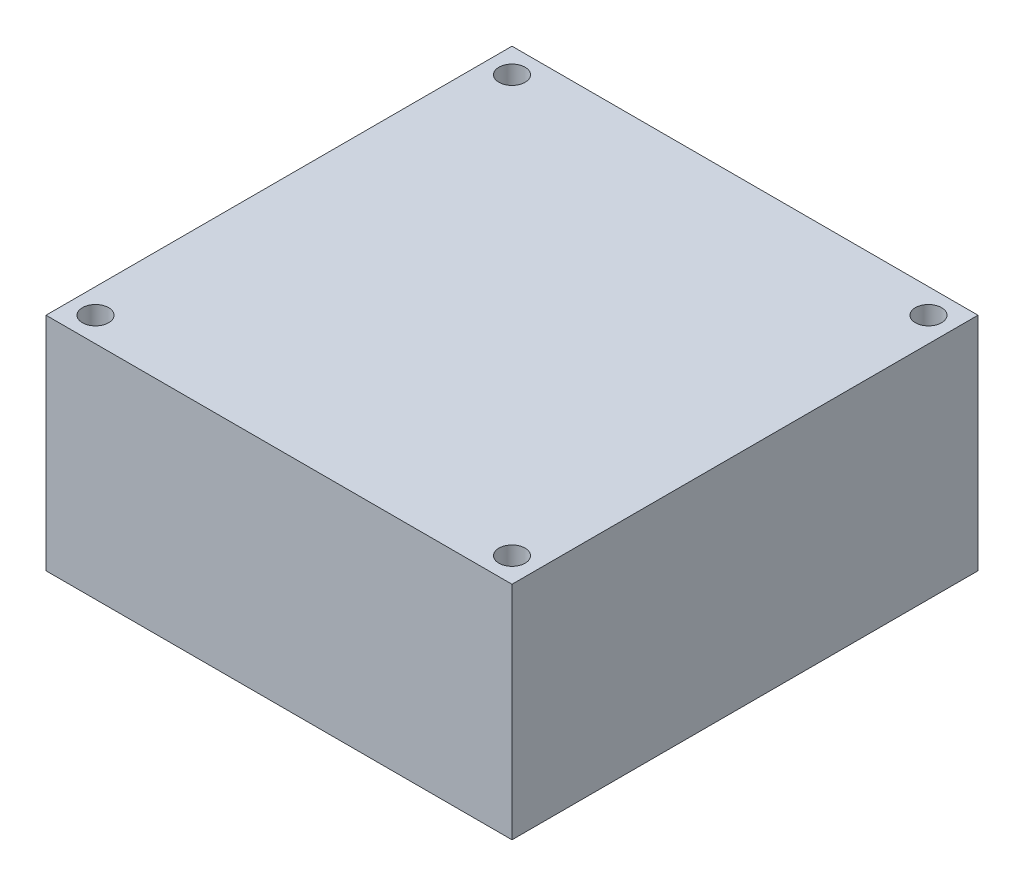
ISO-10303-21;
HEADER;
FILE_DESCRIPTION(('STEP AP214'),'2;1');
FILE_NAME('part.step','',(''),(''),'','','');
FILE_SCHEMA(('AUTOMOTIVE_DESIGN { 1 0 10303 214 1 1 1 1 }'));
ENDSEC;
DATA;
#1=APPLICATION_CONTEXT('core data for automotive mechanical design processes');
#2=APPLICATION_PROTOCOL_DEFINITION('international standard','automotive_design',2000,#1);
#3=PRODUCT_CONTEXT('',#1,'mechanical');
#4=PRODUCT('Part','Part','',(#3));
#5=PRODUCT_RELATED_PRODUCT_CATEGORY('part','',(#4));
#6=PRODUCT_DEFINITION_FORMATION('','',#4);
#7=PRODUCT_DEFINITION_CONTEXT('part definition',#1,'design');
#8=PRODUCT_DEFINITION('design','',#6,#7);
#9=PRODUCT_DEFINITION_SHAPE('','',#8);
#10=(LENGTH_UNIT() NAMED_UNIT(*) SI_UNIT(.MILLI.,.METRE.));
#11=(NAMED_UNIT(*) PLANE_ANGLE_UNIT() SI_UNIT($,.RADIAN.));
#12=(NAMED_UNIT(*) SI_UNIT($,.STERADIAN.) SOLID_ANGLE_UNIT());
#13=UNCERTAINTY_MEASURE_WITH_UNIT(LENGTH_MEASURE(1.E-05),#10,'distance_accuracy_value','');
#14=(GEOMETRIC_REPRESENTATION_CONTEXT(3) GLOBAL_UNCERTAINTY_ASSIGNED_CONTEXT((#13)) GLOBAL_UNIT_ASSIGNED_CONTEXT((#10,
#11,#12)) REPRESENTATION_CONTEXT('',''));
#15=CARTESIAN_POINT('',(0.,0.,0.));
#16=DIRECTION('',(0.,0.,1.));
#17=DIRECTION('',(1.,0.,0.));
#18=AXIS2_PLACEMENT_3D('',#15,#16,#17);
#19=CARTESIAN_POINT('',(0.,38.,0.));
#20=DIRECTION('',(1.,0.,0.));
#21=DIRECTION('',(0.,0.,-1.));
#22=AXIS2_PLACEMENT_3D('',#19,#20,#21);
#23=PLANE('',#22);
#24=DIRECTION('',(0.,0.,1.));
#25=VECTOR('',#24,1.);
#26=CARTESIAN_POINT('',(0.,0.,0.));
#27=LINE('',#26,#25);
#28=CARTESIAN_POINT('',(0.,0.,-80.));
#29=VERTEX_POINT('',#28);
#30=CARTESIAN_POINT('',(0.,0.,0.));
#31=VERTEX_POINT('',#30);
#32=EDGE_CURVE('E96',#29,#31,#27,.T.);
#33=ORIENTED_EDGE('',*,*,#32,.T.);
#34=DIRECTION('',(0.,-1.,0.));
#35=VECTOR('',#34,1.);
#36=CARTESIAN_POINT('',(0.,38.,0.));
#37=LINE('',#36,#35);
#38=CARTESIAN_POINT('',(0.,38.,0.));
#39=VERTEX_POINT('',#38);
#40=EDGE_CURVE('E11',#39,#31,#37,.T.);
#41=ORIENTED_EDGE('',*,*,#40,.F.);
#42=DIRECTION('',(0.,0.,1.));
#43=VECTOR('',#42,1.);
#44=CARTESIAN_POINT('',(0.,38.,0.));
#45=LINE('',#44,#43);
#46=CARTESIAN_POINT('',(0.,38.,-80.));
#47=VERTEX_POINT('',#46);
#48=EDGE_CURVE('E84',#47,#39,#45,.T.);
#49=ORIENTED_EDGE('',*,*,#48,.F.);
#50=DIRECTION('',(0.,-1.,0.));
#51=VECTOR('',#50,1.);
#52=CARTESIAN_POINT('',(0.,38.,-80.));
#53=LINE('',#52,#51);
#54=EDGE_CURVE('E92',#47,#29,#53,.T.);
#55=ORIENTED_EDGE('',*,*,#54,.T.);
#56=EDGE_LOOP('',(#33,#41,#49,#55));
#57=FACE_BOUND('',#56,.T.);
#58=ADVANCED_FACE('F33',(#57),#23,.F.);
#59=CARTESIAN_POINT('',(0.,38.,0.));
#60=DIRECTION('',(0.,0.,-1.));
#61=DIRECTION('',(-1.,0.,0.));
#62=AXIS2_PLACEMENT_3D('',#59,#60,#61);
#63=PLANE('',#62);
#64=DIRECTION('',(1.,0.,0.));
#65=VECTOR('',#64,1.);
#66=CARTESIAN_POINT('',(0.,0.,0.));
#67=LINE('',#66,#65);
#68=CARTESIAN_POINT('',(80.,0.,0.));
#69=VERTEX_POINT('',#68);
#70=EDGE_CURVE('E88',#31,#69,#67,.T.);
#71=ORIENTED_EDGE('',*,*,#70,.T.);
#72=DIRECTION('',(0.,-1.,0.));
#73=VECTOR('',#72,1.);
#74=CARTESIAN_POINT('',(80.,38.,0.));
#75=LINE('',#74,#73);
#76=CARTESIAN_POINT('',(80.,38.,0.));
#77=VERTEX_POINT('',#76);
#78=EDGE_CURVE('E41',#77,#69,#75,.T.);
#79=ORIENTED_EDGE('',*,*,#78,.F.);
#80=DIRECTION('',(1.,0.,0.));
#81=VECTOR('',#80,1.);
#82=CARTESIAN_POINT('',(0.,38.,0.));
#83=LINE('',#82,#81);
#84=EDGE_CURVE('E79',#39,#77,#83,.T.);
#85=ORIENTED_EDGE('',*,*,#84,.F.);
#86=ORIENTED_EDGE('',*,*,#40,.T.);
#87=EDGE_LOOP('',(#71,#79,#85,#86));
#88=FACE_BOUND('',#87,.T.);
#89=ADVANCED_FACE('F87',(#88),#63,.F.);
#90=CARTESIAN_POINT('',(80.,38.,0.));
#91=DIRECTION('',(-1.,0.,0.));
#92=DIRECTION('',(0.,0.,1.));
#93=AXIS2_PLACEMENT_3D('',#90,#91,#92);
#94=PLANE('',#93);
#95=DIRECTION('',(0.,0.,-1.));
#96=VECTOR('',#95,1.);
#97=CARTESIAN_POINT('',(80.,0.,0.));
#98=LINE('',#97,#96);
#99=CARTESIAN_POINT('',(80.,0.,-80.));
#100=VERTEX_POINT('',#99);
#101=EDGE_CURVE('E66',#69,#100,#98,.T.);
#102=ORIENTED_EDGE('',*,*,#101,.T.);
#103=DIRECTION('',(0.,-1.,0.));
#104=VECTOR('',#103,1.);
#105=CARTESIAN_POINT('',(80.,38.,-80.));
#106=LINE('',#105,#104);
#107=CARTESIAN_POINT('',(80.,38.,-80.));
#108=VERTEX_POINT('',#107);
#109=EDGE_CURVE('E89',#108,#100,#106,.T.);
#110=ORIENTED_EDGE('',*,*,#109,.F.);
#111=DIRECTION('',(0.,0.,-1.));
#112=VECTOR('',#111,1.);
#113=CARTESIAN_POINT('',(80.,38.,0.));
#114=LINE('',#113,#112);
#115=EDGE_CURVE('E82',#77,#108,#114,.T.);
#116=ORIENTED_EDGE('',*,*,#115,.F.);
#117=ORIENTED_EDGE('',*,*,#78,.T.);
#118=EDGE_LOOP('',(#102,#110,#116,#117));
#119=FACE_BOUND('',#118,.T.);
#120=ADVANCED_FACE('F90',(#119),#94,.F.);
#121=CARTESIAN_POINT('',(0.,38.,-80.));
#122=DIRECTION('',(0.,0.,1.));
#123=DIRECTION('',(1.,0.,0.));
#124=AXIS2_PLACEMENT_3D('',#121,#122,#123);
#125=PLANE('',#124);
#126=DIRECTION('',(-1.,0.,0.));
#127=VECTOR('',#126,1.);
#128=CARTESIAN_POINT('',(0.,0.,-80.));
#129=LINE('',#128,#127);
#130=EDGE_CURVE('E72',#100,#29,#129,.T.);
#131=ORIENTED_EDGE('',*,*,#130,.T.);
#132=ORIENTED_EDGE('',*,*,#54,.F.);
#133=DIRECTION('',(-1.,0.,0.));
#134=VECTOR('',#133,1.);
#135=CARTESIAN_POINT('',(0.,38.,-80.));
#136=LINE('',#135,#134);
#137=EDGE_CURVE('E49',#108,#47,#136,.T.);
#138=ORIENTED_EDGE('',*,*,#137,.F.);
#139=ORIENTED_EDGE('',*,*,#109,.T.);
#140=EDGE_LOOP('',(#131,#132,#138,#139));
#141=FACE_BOUND('',#140,.T.);
#142=ADVANCED_FACE('F104',(#141),#125,.F.);
#143=CARTESIAN_POINT('',(0.,38.,-80.));
#144=DIRECTION('',(0.,-1.,0.));
#145=DIRECTION('',(0.,0.,-1.));
#146=AXIS2_PLACEMENT_3D('',#143,#144,#145);
#147=PLANE('',#146);
#148=CARTESIAN_POINT('',(4.25,38.,-4.25));
#149=DIRECTION('',(0.,1.,0.));
#150=DIRECTION('',(0.,0.,1.));
#151=AXIS2_PLACEMENT_3D('',#148,#149,#150);
#152=CIRCLE('',#151,2.25);
#153=CARTESIAN_POINT('',(4.25,38.,-2.));
#154=VERTEX_POINT('',#153);
#155=EDGE_CURVE('E128',#154,#154,#152,.T.);
#156=ORIENTED_EDGE('',*,*,#155,.F.);
#157=EDGE_LOOP('',(#156));
#158=FACE_BOUND('',#157,.T.);
#159=CARTESIAN_POINT('',(75.75,38.,-4.25));
#160=DIRECTION('',(0.,1.,0.));
#161=DIRECTION('',(0.,0.,1.));
#162=AXIS2_PLACEMENT_3D('',#159,#160,#161);
#163=CIRCLE('',#162,2.25);
#164=CARTESIAN_POINT('',(75.75,38.,-2.00000000000001));
#165=VERTEX_POINT('',#164);
#166=EDGE_CURVE('E122',#165,#165,#163,.T.);
#167=ORIENTED_EDGE('',*,*,#166,.F.);
#168=EDGE_LOOP('',(#167));
#169=FACE_BOUND('',#168,.T.);
#170=CARTESIAN_POINT('',(75.75,38.,-75.75));
#171=DIRECTION('',(0.,1.,0.));
#172=DIRECTION('',(0.,0.,1.));
#173=AXIS2_PLACEMENT_3D('',#170,#171,#172);
#174=CIRCLE('',#173,2.25);
#175=CARTESIAN_POINT('',(75.75,38.,-73.5));
#176=VERTEX_POINT('',#175);
#177=EDGE_CURVE('E116',#176,#176,#174,.T.);
#178=ORIENTED_EDGE('',*,*,#177,.F.);
#179=EDGE_LOOP('',(#178));
#180=FACE_BOUND('',#179,.T.);
#181=CARTESIAN_POINT('',(4.25,38.,-75.75));
#182=DIRECTION('',(0.,1.,0.));
#183=DIRECTION('',(0.,0.,1.));
#184=AXIS2_PLACEMENT_3D('',#181,#182,#183);
#185=CIRCLE('',#184,2.25);
#186=CARTESIAN_POINT('',(4.25,38.,-73.5));
#187=VERTEX_POINT('',#186);
#188=EDGE_CURVE('E110',#187,#187,#185,.T.);
#189=ORIENTED_EDGE('',*,*,#188,.F.);
#190=EDGE_LOOP('',(#189));
#191=FACE_BOUND('',#190,.T.);
#192=ORIENTED_EDGE('',*,*,#48,.T.);
#193=ORIENTED_EDGE('',*,*,#84,.T.);
#194=ORIENTED_EDGE('',*,*,#115,.T.);
#195=ORIENTED_EDGE('',*,*,#137,.T.);
#196=EDGE_LOOP('',(#192,#193,#194,#195));
#197=FACE_BOUND('',#196,.T.);
#198=ADVANCED_FACE('F80',(#158,#169,#180,#191,#197),#147,.F.);
#199=CARTESIAN_POINT('',(0.,0.,-80.));
#200=DIRECTION('',(0.,-1.,0.));
#201=DIRECTION('',(0.,0.,-1.));
#202=AXIS2_PLACEMENT_3D('',#199,#200,#201);
#203=PLANE('',#202);
#204=CARTESIAN_POINT('',(4.25,0.,-4.25));
#205=DIRECTION('',(0.,1.,0.));
#206=DIRECTION('',(0.,0.,1.));
#207=AXIS2_PLACEMENT_3D('',#204,#205,#206);
#208=CIRCLE('',#207,2.25);
#209=CARTESIAN_POINT('',(4.25,0.,-2.));
#210=VERTEX_POINT('',#209);
#211=EDGE_CURVE('E125',#210,#210,#208,.T.);
#212=ORIENTED_EDGE('',*,*,#211,.T.);
#213=EDGE_LOOP('',(#212));
#214=FACE_BOUND('',#213,.T.);
#215=CARTESIAN_POINT('',(75.75,0.,-4.25));
#216=DIRECTION('',(0.,1.,0.));
#217=DIRECTION('',(0.,0.,1.));
#218=AXIS2_PLACEMENT_3D('',#215,#216,#217);
#219=CIRCLE('',#218,2.25);
#220=CARTESIAN_POINT('',(75.75,0.,-2.00000000000001));
#221=VERTEX_POINT('',#220);
#222=EDGE_CURVE('E119',#221,#221,#219,.T.);
#223=ORIENTED_EDGE('',*,*,#222,.T.);
#224=EDGE_LOOP('',(#223));
#225=FACE_BOUND('',#224,.T.);
#226=CARTESIAN_POINT('',(75.75,0.,-75.75));
#227=DIRECTION('',(0.,1.,0.));
#228=DIRECTION('',(0.,0.,1.));
#229=AXIS2_PLACEMENT_3D('',#226,#227,#228);
#230=CIRCLE('',#229,2.25);
#231=CARTESIAN_POINT('',(75.75,0.,-73.5));
#232=VERTEX_POINT('',#231);
#233=EDGE_CURVE('E113',#232,#232,#230,.T.);
#234=ORIENTED_EDGE('',*,*,#233,.T.);
#235=EDGE_LOOP('',(#234));
#236=FACE_BOUND('',#235,.T.);
#237=CARTESIAN_POINT('',(4.25,0.,-75.75));
#238=DIRECTION('',(0.,1.,0.));
#239=DIRECTION('',(0.,0.,1.));
#240=AXIS2_PLACEMENT_3D('',#237,#238,#239);
#241=CIRCLE('',#240,2.25);
#242=CARTESIAN_POINT('',(4.25,0.,-73.5));
#243=VERTEX_POINT('',#242);
#244=EDGE_CURVE('E99',#243,#243,#241,.T.);
#245=ORIENTED_EDGE('',*,*,#244,.T.);
#246=EDGE_LOOP('',(#245));
#247=FACE_BOUND('',#246,.T.);
#248=ORIENTED_EDGE('',*,*,#32,.F.);
#249=ORIENTED_EDGE('',*,*,#130,.F.);
#250=ORIENTED_EDGE('',*,*,#101,.F.);
#251=ORIENTED_EDGE('',*,*,#70,.F.);
#252=EDGE_LOOP('',(#248,#249,#250,#251));
#253=FACE_BOUND('',#252,.T.);
#254=ADVANCED_FACE('F107',(#214,#225,#236,#247,#253),#203,.T.);
#255=CARTESIAN_POINT('',(4.25,0.,-75.75));
#256=DIRECTION('',(0.,1.,0.));
#257=DIRECTION('',(0.,0.,1.));
#258=AXIS2_PLACEMENT_3D('',#255,#256,#257);
#259=CYLINDRICAL_SURFACE('',#258,2.25);
#260=ORIENTED_EDGE('',*,*,#244,.F.);
#261=EDGE_LOOP('',(#260));
#262=FACE_BOUND('',#261,.T.);
#263=ORIENTED_EDGE('',*,*,#188,.T.);
#264=EDGE_LOOP('',(#263));
#265=FACE_BOUND('',#264,.T.);
#266=ADVANCED_FACE('F152',(#262,#265),#259,.F.);
#267=CARTESIAN_POINT('',(75.75,0.,-75.75));
#268=DIRECTION('',(0.,1.,0.));
#269=DIRECTION('',(0.,0.,1.));
#270=AXIS2_PLACEMENT_3D('',#267,#268,#269);
#271=CYLINDRICAL_SURFACE('',#270,2.25);
#272=ORIENTED_EDGE('',*,*,#233,.F.);
#273=EDGE_LOOP('',(#272));
#274=FACE_BOUND('',#273,.T.);
#275=ORIENTED_EDGE('',*,*,#177,.T.);
#276=EDGE_LOOP('',(#275));
#277=FACE_BOUND('',#276,.T.);
#278=ADVANCED_FACE('F154',(#274,#277),#271,.F.);
#279=CARTESIAN_POINT('',(75.75,0.,-4.25));
#280=DIRECTION('',(0.,1.,0.));
#281=DIRECTION('',(0.,0.,1.));
#282=AXIS2_PLACEMENT_3D('',#279,#280,#281);
#283=CYLINDRICAL_SURFACE('',#282,2.25);
#284=ORIENTED_EDGE('',*,*,#222,.F.);
#285=EDGE_LOOP('',(#284));
#286=FACE_BOUND('',#285,.T.);
#287=ORIENTED_EDGE('',*,*,#166,.T.);
#288=EDGE_LOOP('',(#287));
#289=FACE_BOUND('',#288,.T.);
#290=ADVANCED_FACE('F139',(#286,#289),#283,.F.);
#291=CARTESIAN_POINT('',(4.25,0.,-4.25));
#292=DIRECTION('',(0.,1.,0.));
#293=DIRECTION('',(0.,0.,1.));
#294=AXIS2_PLACEMENT_3D('',#291,#292,#293);
#295=CYLINDRICAL_SURFACE('',#294,2.25);
#296=ORIENTED_EDGE('',*,*,#211,.F.);
#297=EDGE_LOOP('',(#296));
#298=FACE_BOUND('',#297,.T.);
#299=ORIENTED_EDGE('',*,*,#155,.T.);
#300=EDGE_LOOP('',(#299));
#301=FACE_BOUND('',#300,.T.);
#302=ADVANCED_FACE('F136',(#298,#301),#295,.F.);
#303=CLOSED_SHELL('',(#58,#89,#120,#142,#198,#254,#266,#278,#290,#302));
#304=MANIFOLD_SOLID_BREP('B2',#303);
#305=ADVANCED_BREP_SHAPE_REPRESENTATION('',(#18,#304),#14);
#306=SHAPE_DEFINITION_REPRESENTATION(#9,#305);
ENDSEC;
END-ISO-10303-21;
